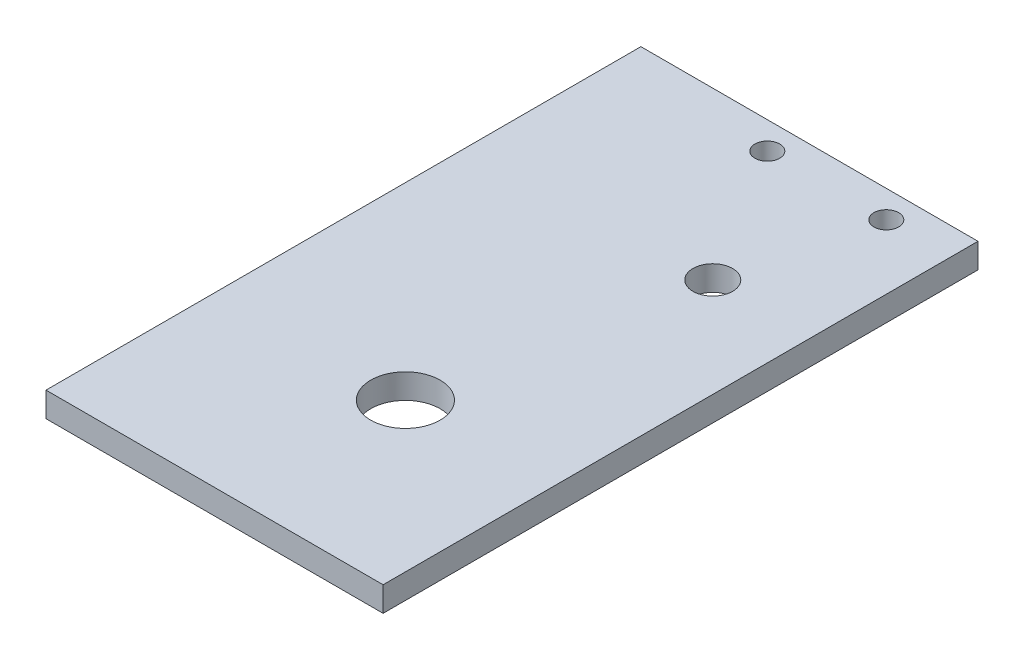
ISO-10303-21;
HEADER;
FILE_DESCRIPTION(('STEP AP214'),'2;1');
FILE_NAME('part.step','',(''),(''),'','','');
FILE_SCHEMA(('AUTOMOTIVE_DESIGN { 1 0 10303 214 1 1 1 1 }'));
ENDSEC;
DATA;
#1=APPLICATION_CONTEXT('core data for automotive mechanical design processes');
#2=APPLICATION_PROTOCOL_DEFINITION('international standard','automotive_design',2000,#1);
#3=PRODUCT_CONTEXT('',#1,'mechanical');
#4=PRODUCT('Part','Part','',(#3));
#5=PRODUCT_RELATED_PRODUCT_CATEGORY('part','',(#4));
#6=PRODUCT_DEFINITION_FORMATION('','',#4);
#7=PRODUCT_DEFINITION_CONTEXT('part definition',#1,'design');
#8=PRODUCT_DEFINITION('design','',#6,#7);
#9=PRODUCT_DEFINITION_SHAPE('','',#8);
#10=(LENGTH_UNIT() NAMED_UNIT(*) SI_UNIT(.MILLI.,.METRE.));
#11=(NAMED_UNIT(*) PLANE_ANGLE_UNIT() SI_UNIT($,.RADIAN.));
#12=(NAMED_UNIT(*) SI_UNIT($,.STERADIAN.) SOLID_ANGLE_UNIT());
#13=UNCERTAINTY_MEASURE_WITH_UNIT(LENGTH_MEASURE(1.E-05),#10,'distance_accuracy_value','');
#14=(GEOMETRIC_REPRESENTATION_CONTEXT(3) GLOBAL_UNCERTAINTY_ASSIGNED_CONTEXT((#13)) GLOBAL_UNIT_ASSIGNED_CONTEXT((#10,
#11,#12)) REPRESENTATION_CONTEXT('',''));
#15=CARTESIAN_POINT('',(0.,0.,0.));
#16=DIRECTION('',(0.,0.,1.));
#17=DIRECTION('',(1.,0.,0.));
#18=AXIS2_PLACEMENT_3D('',#15,#16,#17);
#19=CARTESIAN_POINT('',(-68.,-35.,120.));
#20=DIRECTION('',(0.,-1.,0.));
#21=DIRECTION('',(0.,0.,-1.));
#22=AXIS2_PLACEMENT_3D('',#19,#20,#21);
#23=PLANE('',#22);
#24=CARTESIAN_POINT('',(-20.,-35.,33.5));
#25=DIRECTION('',(0.,1.,0.));
#26=DIRECTION('',(0.,0.,1.));
#27=AXIS2_PLACEMENT_3D('',#24,#25,#26);
#28=CIRCLE('',#27,4.);
#29=CARTESIAN_POINT('',(-20.,-35.,37.5));
#30=VERTEX_POINT('',#29);
#31=EDGE_CURVE('E165',#30,#30,#28,.T.);
#32=ORIENTED_EDGE('',*,*,#31,.F.);
#33=EDGE_LOOP('',(#32));
#34=FACE_BOUND('',#33,.T.);
#35=CARTESIAN_POINT('',(-37.0000000000004,-35.,5.49999999999999));
#36=DIRECTION('',(0.,-1.,0.));
#37=DIRECTION('',(0.,0.,-1.));
#38=AXIS2_PLACEMENT_3D('',#35,#36,#37);
#39=CIRCLE('',#38,2.49999999999999);
#40=CARTESIAN_POINT('',(-37.0000000000004,-35.,3.));
#41=VERTEX_POINT('',#40);
#42=EDGE_CURVE('E157',#41,#41,#39,.T.);
#43=ORIENTED_EDGE('',*,*,#42,.T.);
#44=EDGE_LOOP('',(#43));
#45=FACE_BOUND('',#44,.T.);
#46=CARTESIAN_POINT('',(-13.0000000000004,-35.,5.49999999999999));
#47=DIRECTION('',(0.,-1.,0.));
#48=DIRECTION('',(0.,0.,-1.));
#49=AXIS2_PLACEMENT_3D('',#46,#47,#48);
#50=CIRCLE('',#49,2.49999999999999);
#51=CARTESIAN_POINT('',(-13.0000000000004,-35.,3.));
#52=VERTEX_POINT('',#51);
#53=EDGE_CURVE('E149',#52,#52,#50,.T.);
#54=ORIENTED_EDGE('',*,*,#53,.T.);
#55=EDGE_LOOP('',(#54));
#56=FACE_BOUND('',#55,.T.);
#57=CARTESIAN_POINT('',(-30.,-35.,85.5));
#58=DIRECTION('',(0.,-1.,0.));
#59=DIRECTION('',(0.,0.,-1.));
#60=AXIS2_PLACEMENT_3D('',#57,#58,#59);
#61=CIRCLE('',#60,7.);
#62=CARTESIAN_POINT('',(-30.,-35.,78.5));
#63=VERTEX_POINT('',#62);
#64=EDGE_CURVE('E103',#63,#63,#61,.T.);
#65=ORIENTED_EDGE('',*,*,#64,.T.);
#66=EDGE_LOOP('',(#65));
#67=FACE_BOUND('',#66,.T.);
#68=DIRECTION('',(-1.,0.,0.));
#69=VECTOR('',#68,1.);
#70=CARTESIAN_POINT('',(-68.,-35.,0.));
#71=LINE('',#70,#69);
#72=CARTESIAN_POINT('',(0.,-35.,0.));
#73=VERTEX_POINT('',#72);
#74=CARTESIAN_POINT('',(-68.,-35.,0.));
#75=VERTEX_POINT('',#74);
#76=EDGE_CURVE('E61',#73,#75,#71,.T.);
#77=ORIENTED_EDGE('',*,*,#76,.T.);
#78=DIRECTION('',(0.,0.,-1.));
#79=VECTOR('',#78,1.);
#80=CARTESIAN_POINT('',(-68.,-35.,120.));
#81=LINE('',#80,#79);
#82=CARTESIAN_POINT('',(-68.,-35.,120.));
#83=VERTEX_POINT('',#82);
#84=EDGE_CURVE('E11',#83,#75,#81,.T.);
#85=ORIENTED_EDGE('',*,*,#84,.F.);
#86=DIRECTION('',(-1.,0.,0.));
#87=VECTOR('',#86,1.);
#88=CARTESIAN_POINT('',(-68.,-35.,120.));
#89=LINE('',#88,#87);
#90=CARTESIAN_POINT('',(0.,-35.,120.));
#91=VERTEX_POINT('',#90);
#92=EDGE_CURVE('E90',#91,#83,#89,.T.);
#93=ORIENTED_EDGE('',*,*,#92,.F.);
#94=DIRECTION('',(0.,0.,1.));
#95=VECTOR('',#94,1.);
#96=CARTESIAN_POINT('',(0.,-35.,120.));
#97=LINE('',#96,#95);
#98=EDGE_CURVE('E97',#73,#91,#97,.T.);
#99=ORIENTED_EDGE('',*,*,#98,.F.);
#100=EDGE_LOOP('',(#77,#85,#93,#99));
#101=FACE_BOUND('',#100,.T.);
#102=ADVANCED_FACE('F45',(#34,#45,#56,#67,#101),#23,.F.);
#103=CARTESIAN_POINT('',(-68.,-35.,120.));
#104=DIRECTION('',(1.,0.,0.));
#105=DIRECTION('',(0.,0.,-1.));
#106=AXIS2_PLACEMENT_3D('',#103,#104,#105);
#107=PLANE('',#106);
#108=DIRECTION('',(0.,-1.,0.));
#109=VECTOR('',#108,1.);
#110=CARTESIAN_POINT('',(-68.,-35.,0.));
#111=LINE('',#110,#109);
#112=CARTESIAN_POINT('',(-68.,-40.,0.));
#113=VERTEX_POINT('',#112);
#114=EDGE_CURVE('E123',#75,#113,#111,.T.);
#115=ORIENTED_EDGE('',*,*,#114,.T.);
#116=DIRECTION('',(0.,0.,-1.));
#117=VECTOR('',#116,1.);
#118=CARTESIAN_POINT('',(-68.,-40.,120.));
#119=LINE('',#118,#117);
#120=CARTESIAN_POINT('',(-68.,-40.,120.));
#121=VERTEX_POINT('',#120);
#122=EDGE_CURVE('E54',#121,#113,#119,.T.);
#123=ORIENTED_EDGE('',*,*,#122,.F.);
#124=DIRECTION('',(0.,-1.,0.));
#125=VECTOR('',#124,1.);
#126=CARTESIAN_POINT('',(-68.,-35.,120.));
#127=LINE('',#126,#125);
#128=EDGE_CURVE('E107',#83,#121,#127,.T.);
#129=ORIENTED_EDGE('',*,*,#128,.F.);
#130=ORIENTED_EDGE('',*,*,#84,.T.);
#131=EDGE_LOOP('',(#115,#123,#129,#130));
#132=FACE_BOUND('',#131,.T.);
#133=ADVANCED_FACE('F137',(#132),#107,.F.);
#134=CARTESIAN_POINT('',(0.,-40.,120.));
#135=DIRECTION('',(0.,1.,0.));
#136=DIRECTION('',(0.,0.,1.));
#137=AXIS2_PLACEMENT_3D('',#134,#135,#136);
#138=PLANE('',#137);
#139=CARTESIAN_POINT('',(-20.,-40.,33.5));
#140=DIRECTION('',(0.,1.,0.));
#141=DIRECTION('',(0.,0.,1.));
#142=AXIS2_PLACEMENT_3D('',#139,#140,#141);
#143=CIRCLE('',#142,4.);
#144=CARTESIAN_POINT('',(-20.,-40.,37.5));
#145=VERTEX_POINT('',#144);
#146=EDGE_CURVE('E48',#145,#145,#143,.T.);
#147=ORIENTED_EDGE('',*,*,#146,.T.);
#148=EDGE_LOOP('',(#147));
#149=FACE_BOUND('',#148,.T.);
#150=CARTESIAN_POINT('',(-37.0000000000004,-40.,5.49999999999999));
#151=DIRECTION('',(0.,-1.,0.));
#152=DIRECTION('',(0.,0.,-1.));
#153=AXIS2_PLACEMENT_3D('',#150,#151,#152);
#154=CIRCLE('',#153,2.49999999999999);
#155=CARTESIAN_POINT('',(-37.0000000000004,-40.,3.));
#156=VERTEX_POINT('',#155);
#157=EDGE_CURVE('E161',#156,#156,#154,.T.);
#158=ORIENTED_EDGE('',*,*,#157,.F.);
#159=EDGE_LOOP('',(#158));
#160=FACE_BOUND('',#159,.T.);
#161=CARTESIAN_POINT('',(-13.0000000000004,-40.,5.49999999999999));
#162=DIRECTION('',(0.,-1.,0.));
#163=DIRECTION('',(0.,0.,-1.));
#164=AXIS2_PLACEMENT_3D('',#161,#162,#163);
#165=CIRCLE('',#164,2.49999999999999);
#166=CARTESIAN_POINT('',(-13.0000000000004,-40.,3.));
#167=VERTEX_POINT('',#166);
#168=EDGE_CURVE('E153',#167,#167,#165,.T.);
#169=ORIENTED_EDGE('',*,*,#168,.F.);
#170=EDGE_LOOP('',(#169));
#171=FACE_BOUND('',#170,.T.);
#172=CARTESIAN_POINT('',(-30.,-40.,85.5));
#173=DIRECTION('',(0.,-1.,0.));
#174=DIRECTION('',(1.,0.,0.));
#175=AXIS2_PLACEMENT_3D('',#172,#173,#174);
#176=CIRCLE('',#175,7.);
#177=CARTESIAN_POINT('',(-23.,-40.,85.5));
#178=VERTEX_POINT('',#177);
#179=EDGE_CURVE('E145',#178,#178,#176,.T.);
#180=ORIENTED_EDGE('',*,*,#179,.F.);
#181=EDGE_LOOP('',(#180));
#182=FACE_BOUND('',#181,.T.);
#183=DIRECTION('',(1.,0.,0.));
#184=VECTOR('',#183,1.);
#185=CARTESIAN_POINT('',(0.,-40.,0.));
#186=LINE('',#185,#184);
#187=CARTESIAN_POINT('',(0.,-40.,0.));
#188=VERTEX_POINT('',#187);
#189=EDGE_CURVE('E86',#113,#188,#186,.T.);
#190=ORIENTED_EDGE('',*,*,#189,.T.);
#191=DIRECTION('',(0.,0.,-1.));
#192=VECTOR('',#191,1.);
#193=CARTESIAN_POINT('',(0.,-40.,120.));
#194=LINE('',#193,#192);
#195=CARTESIAN_POINT('',(0.,-40.,120.));
#196=VERTEX_POINT('',#195);
#197=EDGE_CURVE('E111',#196,#188,#194,.T.);
#198=ORIENTED_EDGE('',*,*,#197,.F.);
#199=DIRECTION('',(1.,0.,0.));
#200=VECTOR('',#199,1.);
#201=CARTESIAN_POINT('',(0.,-40.,120.));
#202=LINE('',#201,#200);
#203=EDGE_CURVE('E70',#121,#196,#202,.T.);
#204=ORIENTED_EDGE('',*,*,#203,.F.);
#205=ORIENTED_EDGE('',*,*,#122,.T.);
#206=EDGE_LOOP('',(#190,#198,#204,#205));
#207=FACE_BOUND('',#206,.T.);
#208=ADVANCED_FACE('F134',(#149,#160,#171,#182,#207),#138,.F.);
#209=CARTESIAN_POINT('',(0.,0.,120.));
#210=DIRECTION('',(-1.,0.,0.));
#211=DIRECTION('',(0.,-1.,0.));
#212=AXIS2_PLACEMENT_3D('',#209,#210,#211);
#213=PLANE('',#212);
#214=ORIENTED_EDGE('',*,*,#98,.T.);
#215=DIRECTION('',(0.,1.,0.));
#216=VECTOR('',#215,1.);
#217=CARTESIAN_POINT('',(0.,0.,120.));
#218=LINE('',#217,#216);
#219=EDGE_CURVE('E99',#196,#91,#218,.T.);
#220=ORIENTED_EDGE('',*,*,#219,.F.);
#221=ORIENTED_EDGE('',*,*,#197,.T.);
#222=DIRECTION('',(0.,1.,0.));
#223=VECTOR('',#222,1.);
#224=CARTESIAN_POINT('',(0.,0.,0.));
#225=LINE('',#224,#223);
#226=EDGE_CURVE('E100',#188,#73,#225,.T.);
#227=ORIENTED_EDGE('',*,*,#226,.T.);
#228=EDGE_LOOP('',(#214,#220,#221,#227));
#229=FACE_BOUND('',#228,.T.);
#230=ADVANCED_FACE('F98',(#229),#213,.F.);
#231=CARTESIAN_POINT('',(0.,0.,120.));
#232=DIRECTION('',(0.,0.,-1.));
#233=DIRECTION('',(-1.,0.,0.));
#234=AXIS2_PLACEMENT_3D('',#231,#232,#233);
#235=PLANE('',#234);
#236=ORIENTED_EDGE('',*,*,#219,.T.);
#237=ORIENTED_EDGE('',*,*,#92,.T.);
#238=ORIENTED_EDGE('',*,*,#128,.T.);
#239=ORIENTED_EDGE('',*,*,#203,.T.);
#240=EDGE_LOOP('',(#236,#237,#238,#239));
#241=FACE_BOUND('',#240,.T.);
#242=ADVANCED_FACE('F109',(#241),#235,.F.);
#243=CARTESIAN_POINT('',(0.,0.,0.));
#244=DIRECTION('',(0.,0.,-1.));
#245=DIRECTION('',(-1.,0.,0.));
#246=AXIS2_PLACEMENT_3D('',#243,#244,#245);
#247=PLANE('',#246);
#248=ORIENTED_EDGE('',*,*,#76,.F.);
#249=ORIENTED_EDGE('',*,*,#226,.F.);
#250=ORIENTED_EDGE('',*,*,#189,.F.);
#251=ORIENTED_EDGE('',*,*,#114,.F.);
#252=EDGE_LOOP('',(#248,#249,#250,#251));
#253=FACE_BOUND('',#252,.T.);
#254=ADVANCED_FACE('F136',(#253),#247,.T.);
#255=CARTESIAN_POINT('',(-30.,-30.,85.5));
#256=DIRECTION('',(0.,-1.,0.));
#257=DIRECTION('',(1.,0.,0.));
#258=AXIS2_PLACEMENT_3D('',#255,#256,#257);
#259=CYLINDRICAL_SURFACE('',#258,7.);
#260=ORIENTED_EDGE('',*,*,#179,.T.);
#261=EDGE_LOOP('',(#260));
#262=FACE_BOUND('',#261,.T.);
#263=ORIENTED_EDGE('',*,*,#64,.F.);
#264=EDGE_LOOP('',(#263));
#265=FACE_BOUND('',#264,.T.);
#266=ADVANCED_FACE('F202',(#262,#265),#259,.F.);
#267=CARTESIAN_POINT('',(-13.0000000000004,-40.,5.49999999999999));
#268=DIRECTION('',(0.,-1.,0.));
#269=DIRECTION('',(0.,0.,-1.));
#270=AXIS2_PLACEMENT_3D('',#267,#268,#269);
#271=CYLINDRICAL_SURFACE('',#270,2.49999999999999);
#272=ORIENTED_EDGE('',*,*,#168,.T.);
#273=EDGE_LOOP('',(#272));
#274=FACE_BOUND('',#273,.T.);
#275=ORIENTED_EDGE('',*,*,#53,.F.);
#276=EDGE_LOOP('',(#275));
#277=FACE_BOUND('',#276,.T.);
#278=ADVANCED_FACE('F187',(#274,#277),#271,.F.);
#279=CARTESIAN_POINT('',(-37.0000000000004,-40.,5.49999999999999));
#280=DIRECTION('',(0.,-1.,0.));
#281=DIRECTION('',(0.,0.,-1.));
#282=AXIS2_PLACEMENT_3D('',#279,#280,#281);
#283=CYLINDRICAL_SURFACE('',#282,2.49999999999999);
#284=ORIENTED_EDGE('',*,*,#157,.T.);
#285=EDGE_LOOP('',(#284));
#286=FACE_BOUND('',#285,.T.);
#287=ORIENTED_EDGE('',*,*,#42,.F.);
#288=EDGE_LOOP('',(#287));
#289=FACE_BOUND('',#288,.T.);
#290=ADVANCED_FACE('F182',(#286,#289),#283,.F.);
#291=CARTESIAN_POINT('',(-20.,-55.,33.5));
#292=DIRECTION('',(0.,1.,0.));
#293=DIRECTION('',(0.,0.,1.));
#294=AXIS2_PLACEMENT_3D('',#291,#292,#293);
#295=CYLINDRICAL_SURFACE('',#294,4.);
#296=ORIENTED_EDGE('',*,*,#31,.T.);
#297=EDGE_LOOP('',(#296));
#298=FACE_BOUND('',#297,.T.);
#299=ORIENTED_EDGE('',*,*,#146,.F.);
#300=EDGE_LOOP('',(#299));
#301=FACE_BOUND('',#300,.T.);
#302=ADVANCED_FACE('F180',(#298,#301),#295,.F.);
#303=CLOSED_SHELL('',(#102,#133,#208,#230,#242,#254,#266,#278,#290,#302));
#304=MANIFOLD_SOLID_BREP('B2',#303);
#305=ADVANCED_BREP_SHAPE_REPRESENTATION('',(#18,#304),#14);
#306=SHAPE_DEFINITION_REPRESENTATION(#9,#305);
ENDSEC;
END-ISO-10303-21;
